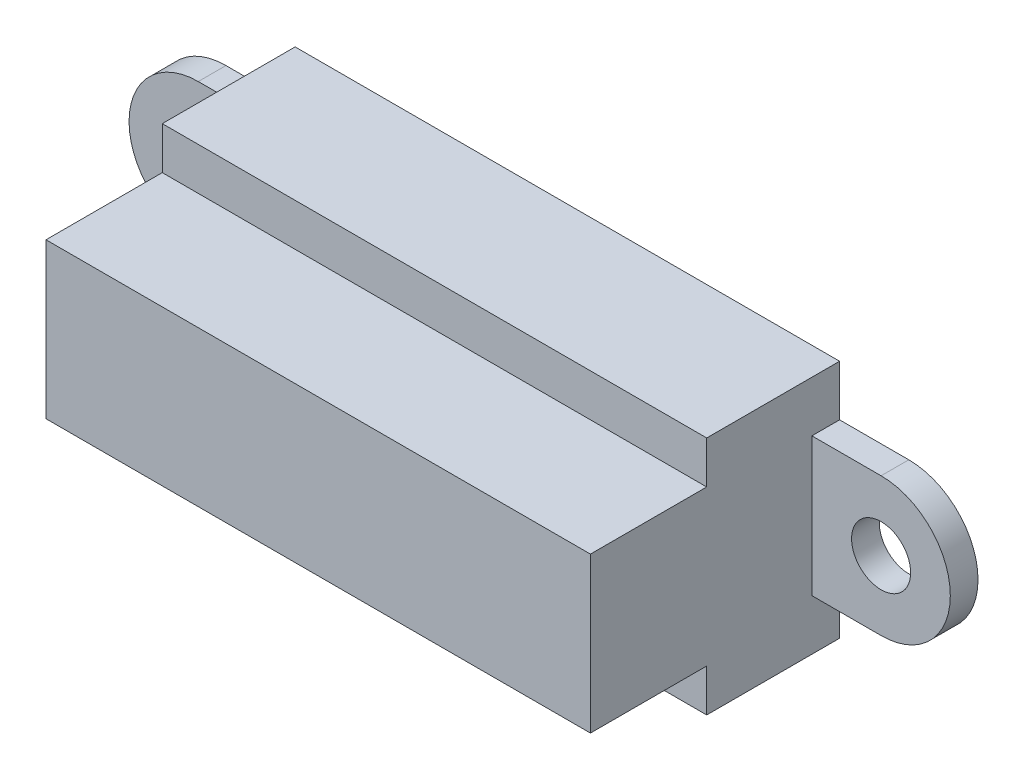
ISO-10303-21;
HEADER;
FILE_DESCRIPTION(('STEP AP214'),'2;1');
FILE_NAME('part.step','',(''),(''),'','','');
FILE_SCHEMA(('AUTOMOTIVE_DESIGN { 1 0 10303 214 1 1 1 1 }'));
ENDSEC;
DATA;
#1=APPLICATION_CONTEXT('core data for automotive mechanical design processes');
#2=APPLICATION_PROTOCOL_DEFINITION('international standard','automotive_design',2000,#1);
#3=PRODUCT_CONTEXT('',#1,'mechanical');
#4=PRODUCT('Part','Part','',(#3));
#5=PRODUCT_RELATED_PRODUCT_CATEGORY('part','',(#4));
#6=PRODUCT_DEFINITION_FORMATION('','',#4);
#7=PRODUCT_DEFINITION_CONTEXT('part definition',#1,'design');
#8=PRODUCT_DEFINITION('design','',#6,#7);
#9=PRODUCT_DEFINITION_SHAPE('','',#8);
#10=(LENGTH_UNIT() NAMED_UNIT(*) SI_UNIT(.MILLI.,.METRE.));
#11=(NAMED_UNIT(*) PLANE_ANGLE_UNIT() SI_UNIT($,.RADIAN.));
#12=(NAMED_UNIT(*) SI_UNIT($,.STERADIAN.) SOLID_ANGLE_UNIT());
#13=UNCERTAINTY_MEASURE_WITH_UNIT(LENGTH_MEASURE(1.E-05),#10,'distance_accuracy_value','');
#14=(GEOMETRIC_REPRESENTATION_CONTEXT(3) GLOBAL_UNCERTAINTY_ASSIGNED_CONTEXT((#13)) GLOBAL_UNIT_ASSIGNED_CONTEXT((#10,
#11,#12)) REPRESENTATION_CONTEXT('',''));
#15=CARTESIAN_POINT('',(0.,0.,0.));
#16=DIRECTION('',(0.,0.,1.));
#17=DIRECTION('',(1.,0.,0.));
#18=AXIS2_PLACEMENT_3D('',#15,#16,#17);
#19=CARTESIAN_POINT('',(0.,0.,7.2));
#20=DIRECTION('',(0.,0.,-1.));
#21=DIRECTION('',(-1.,0.,0.));
#22=AXIS2_PLACEMENT_3D('',#19,#20,#21);
#23=PLANE('',#22);
#24=DIRECTION('',(-1.,0.,0.));
#25=VECTOR('',#24,1.);
#26=CARTESIAN_POINT('',(33.25,4.2,7.2));
#27=LINE('',#26,#25);
#28=CARTESIAN_POINT('',(33.25,4.2,7.2));
#29=VERTEX_POINT('',#28);
#30=CARTESIAN_POINT('',(3.75,4.2,7.2));
#31=VERTEX_POINT('',#30);
#32=EDGE_CURVE('E174',#29,#31,#27,.T.);
#33=ORIENTED_EDGE('',*,*,#32,.F.);
#34=DIRECTION('',(0.,1.,0.));
#35=VECTOR('',#34,1.);
#36=CARTESIAN_POINT('',(33.25,0.,7.2));
#37=LINE('',#36,#35);
#38=CARTESIAN_POINT('',(33.25,6.5,7.2));
#39=VERTEX_POINT('',#38);
#40=EDGE_CURVE('E190',#29,#39,#37,.T.);
#41=ORIENTED_EDGE('',*,*,#40,.T.);
#42=DIRECTION('',(-1.,0.,0.));
#43=VECTOR('',#42,1.);
#44=CARTESIAN_POINT('',(0.,6.5,7.2));
#45=LINE('',#44,#43);
#46=CARTESIAN_POINT('',(3.75,6.5,7.2));
#47=VERTEX_POINT('',#46);
#48=EDGE_CURVE('E194',#39,#47,#45,.T.);
#49=ORIENTED_EDGE('',*,*,#48,.T.);
#50=DIRECTION('',(0.,1.,0.));
#51=VECTOR('',#50,1.);
#52=CARTESIAN_POINT('',(3.75,0.,7.2));
#53=LINE('',#52,#51);
#54=EDGE_CURVE('E56',#31,#47,#53,.T.);
#55=ORIENTED_EDGE('',*,*,#54,.F.);
#56=EDGE_LOOP('',(#33,#41,#49,#55));
#57=FACE_BOUND('',#56,.T.);
#58=ADVANCED_FACE('F41',(#57),#23,.F.);
#59=DIRECTION('',(1.,0.,0.));
#60=VECTOR('',#59,1.);
#61=CARTESIAN_POINT('',(33.25,-4.2,7.2));
#62=LINE('',#61,#60);
#63=CARTESIAN_POINT('',(3.75,-4.2,7.2));
#64=VERTEX_POINT('',#63);
#65=CARTESIAN_POINT('',(33.25,-4.2,7.2));
#66=VERTEX_POINT('',#65);
#67=EDGE_CURVE('E64',#64,#66,#62,.T.);
#68=ORIENTED_EDGE('',*,*,#67,.F.);
#69=CARTESIAN_POINT('',(3.75,-6.5,7.2));
#70=VERTEX_POINT('',#69);
#71=EDGE_CURVE('E178',#70,#64,#53,.T.);
#72=ORIENTED_EDGE('',*,*,#71,.F.);
#73=DIRECTION('',(-1.,0.,0.));
#74=VECTOR('',#73,1.);
#75=CARTESIAN_POINT('',(0.,-6.5,7.2));
#76=LINE('',#75,#74);
#77=CARTESIAN_POINT('',(33.25,-6.5,7.2));
#78=VERTEX_POINT('',#77);
#79=EDGE_CURVE('E189',#78,#70,#76,.T.);
#80=ORIENTED_EDGE('',*,*,#79,.F.);
#81=EDGE_CURVE('E187',#78,#66,#37,.T.);
#82=ORIENTED_EDGE('',*,*,#81,.T.);
#83=EDGE_LOOP('',(#68,#72,#80,#82));
#84=FACE_BOUND('',#83,.T.);
#85=ADVANCED_FACE('F303',(#84),#23,.F.);
#86=CARTESIAN_POINT('',(0.,0.,1.5));
#87=DIRECTION('',(0.,0.,1.));
#88=DIRECTION('',(1.,0.,0.));
#89=AXIS2_PLACEMENT_3D('',#86,#87,#88);
#90=PLANE('',#89);
#91=CARTESIAN_POINT('',(37.,0.,1.5));
#92=DIRECTION('',(0.,0.,1.));
#93=DIRECTION('',(1.,0.,0.));
#94=AXIS2_PLACEMENT_3D('',#91,#92,#93);
#95=CIRCLE('',#94,1.6);
#96=CARTESIAN_POINT('',(38.6,0.,1.5));
#97=VERTEX_POINT('',#96);
#98=EDGE_CURVE('E228',#97,#97,#95,.T.);
#99=ORIENTED_EDGE('',*,*,#98,.F.);
#100=EDGE_LOOP('',(#99));
#101=FACE_BOUND('',#100,.T.);
#102=DIRECTION('',(-1.,0.,0.));
#103=VECTOR('',#102,1.);
#104=CARTESIAN_POINT('',(0.,3.75,1.5));
#105=LINE('',#104,#103);
#106=CARTESIAN_POINT('',(37.,3.75,1.5));
#107=VERTEX_POINT('',#106);
#108=CARTESIAN_POINT('',(33.25,3.75,1.5));
#109=VERTEX_POINT('',#108);
#110=EDGE_CURVE('E251',#107,#109,#105,.T.);
#111=ORIENTED_EDGE('',*,*,#110,.T.);
#112=DIRECTION('',(0.,-1.,0.));
#113=VECTOR('',#112,1.);
#114=CARTESIAN_POINT('',(33.25,0.,1.5));
#115=LINE('',#114,#113);
#116=CARTESIAN_POINT('',(33.25,-3.75,1.5));
#117=VERTEX_POINT('',#116);
#118=EDGE_CURVE('E222',#109,#117,#115,.T.);
#119=ORIENTED_EDGE('',*,*,#118,.T.);
#120=DIRECTION('',(1.,0.,0.));
#121=VECTOR('',#120,1.);
#122=CARTESIAN_POINT('',(0.,-3.75,1.5));
#123=LINE('',#122,#121);
#124=CARTESIAN_POINT('',(37.,-3.75,1.5));
#125=VERTEX_POINT('',#124);
#126=EDGE_CURVE('E243',#117,#125,#123,.T.);
#127=ORIENTED_EDGE('',*,*,#126,.T.);
#128=CARTESIAN_POINT('',(37.,0.,1.5));
#129=DIRECTION('',(0.,0.,1.));
#130=DIRECTION('',(1.,0.,0.));
#131=AXIS2_PLACEMENT_3D('',#128,#129,#130);
#132=CIRCLE('',#131,3.75);
#133=EDGE_CURVE('E248',#125,#107,#132,.T.);
#134=ORIENTED_EDGE('',*,*,#133,.T.);
#135=EDGE_LOOP('',(#111,#119,#127,#134));
#136=FACE_BOUND('',#135,.T.);
#137=ADVANCED_FACE('F336',(#101,#136),#90,.T.);
#138=CARTESIAN_POINT('',(0.,-3.75,1.5));
#139=DIRECTION('',(0.,1.,0.));
#140=DIRECTION('',(0.,0.,1.));
#141=AXIS2_PLACEMENT_3D('',#138,#139,#140);
#142=PLANE('',#141);
#143=DIRECTION('',(0.,0.,1.));
#144=VECTOR('',#143,1.);
#145=CARTESIAN_POINT('',(33.25,-3.75,1.5));
#146=LINE('',#145,#144);
#147=CARTESIAN_POINT('',(33.25,-3.75,0.));
#148=VERTEX_POINT('',#147);
#149=EDGE_CURVE('E224',#148,#117,#146,.T.);
#150=ORIENTED_EDGE('',*,*,#149,.F.);
#151=DIRECTION('',(1.,0.,0.));
#152=VECTOR('',#151,1.);
#153=CARTESIAN_POINT('',(0.,-3.75,0.));
#154=LINE('',#153,#152);
#155=CARTESIAN_POINT('',(37.,-3.75,0.));
#156=VERTEX_POINT('',#155);
#157=EDGE_CURVE('E257',#148,#156,#154,.T.);
#158=ORIENTED_EDGE('',*,*,#157,.T.);
#159=DIRECTION('',(0.,0.,-1.));
#160=VECTOR('',#159,1.);
#161=CARTESIAN_POINT('',(37.,-3.75,1.5));
#162=LINE('',#161,#160);
#163=EDGE_CURVE('E269',#125,#156,#162,.T.);
#164=ORIENTED_EDGE('',*,*,#163,.F.);
#165=ORIENTED_EDGE('',*,*,#126,.F.);
#166=EDGE_LOOP('',(#150,#158,#164,#165));
#167=FACE_BOUND('',#166,.T.);
#168=ADVANCED_FACE('F334',(#167),#142,.F.);
#169=CARTESIAN_POINT('',(0.,3.75,1.5));
#170=DIRECTION('',(0.,-1.,0.));
#171=DIRECTION('',(0.,0.,-1.));
#172=AXIS2_PLACEMENT_3D('',#169,#170,#171);
#173=PLANE('',#172);
#174=DIRECTION('',(0.,0.,-1.));
#175=VECTOR('',#174,1.);
#176=CARTESIAN_POINT('',(33.25,3.75,1.5));
#177=LINE('',#176,#175);
#178=CARTESIAN_POINT('',(33.25,3.75,0.));
#179=VERTEX_POINT('',#178);
#180=EDGE_CURVE('E11',#109,#179,#177,.T.);
#181=ORIENTED_EDGE('',*,*,#180,.F.);
#182=ORIENTED_EDGE('',*,*,#110,.F.);
#183=DIRECTION('',(0.,0.,-1.));
#184=VECTOR('',#183,1.);
#185=CARTESIAN_POINT('',(37.,3.75,1.5));
#186=LINE('',#185,#184);
#187=CARTESIAN_POINT('',(37.,3.75,0.));
#188=VERTEX_POINT('',#187);
#189=EDGE_CURVE('E266',#107,#188,#186,.T.);
#190=ORIENTED_EDGE('',*,*,#189,.T.);
#191=DIRECTION('',(-1.,0.,0.));
#192=VECTOR('',#191,1.);
#193=CARTESIAN_POINT('',(0.,3.75,0.));
#194=LINE('',#193,#192);
#195=EDGE_CURVE('E244',#188,#179,#194,.T.);
#196=ORIENTED_EDGE('',*,*,#195,.T.);
#197=EDGE_LOOP('',(#181,#182,#190,#196));
#198=FACE_BOUND('',#197,.T.);
#199=ADVANCED_FACE('F325',(#198),#173,.F.);
#200=DIRECTION('',(0.,-1.,0.));
#201=VECTOR('',#200,1.);
#202=CARTESIAN_POINT('',(3.75,0.,1.5));
#203=LINE('',#202,#201);
#204=CARTESIAN_POINT('',(3.75,3.75,1.5));
#205=VERTEX_POINT('',#204);
#206=CARTESIAN_POINT('',(3.75,-3.75,1.5));
#207=VERTEX_POINT('',#206);
#208=EDGE_CURVE('E211',#205,#207,#203,.T.);
#209=ORIENTED_EDGE('',*,*,#208,.F.);
#210=CARTESIAN_POINT('',(0.,3.75,1.5));
#211=VERTEX_POINT('',#210);
#212=EDGE_CURVE('E250',#205,#211,#105,.T.);
#213=ORIENTED_EDGE('',*,*,#212,.T.);
#214=CARTESIAN_POINT('',(0.,0.,1.5));
#215=DIRECTION('',(0.,0.,1.));
#216=DIRECTION('',(1.,0.,0.));
#217=AXIS2_PLACEMENT_3D('',#214,#215,#216);
#218=CIRCLE('',#217,3.75);
#219=CARTESIAN_POINT('',(0.,-3.75,1.5));
#220=VERTEX_POINT('',#219);
#221=EDGE_CURVE('E240',#211,#220,#218,.T.);
#222=ORIENTED_EDGE('',*,*,#221,.T.);
#223=EDGE_CURVE('E245',#220,#207,#123,.T.);
#224=ORIENTED_EDGE('',*,*,#223,.T.);
#225=EDGE_LOOP('',(#209,#213,#222,#224));
#226=FACE_BOUND('',#225,.T.);
#227=CARTESIAN_POINT('',(0.,0.,1.5));
#228=DIRECTION('',(0.,0.,1.));
#229=DIRECTION('',(1.,0.,0.));
#230=AXIS2_PLACEMENT_3D('',#227,#228,#229);
#231=CIRCLE('',#230,1.6);
#232=CARTESIAN_POINT('',(1.6,0.,1.5));
#233=VERTEX_POINT('',#232);
#234=EDGE_CURVE('E234',#233,#233,#231,.T.);
#235=ORIENTED_EDGE('',*,*,#234,.F.);
#236=EDGE_LOOP('',(#235));
#237=FACE_BOUND('',#236,.T.);
#238=ADVANCED_FACE('F292',(#226,#237),#90,.T.);
#239=CARTESIAN_POINT('',(0.,0.,0.));
#240=DIRECTION('',(0.,0.,1.));
#241=DIRECTION('',(1.,0.,0.));
#242=AXIS2_PLACEMENT_3D('',#239,#240,#241);
#243=PLANE('',#242);
#244=CARTESIAN_POINT('',(3.75,3.75,0.));
#245=VERTEX_POINT('',#244);
#246=CARTESIAN_POINT('',(0.,3.75,0.));
#247=VERTEX_POINT('',#246);
#248=EDGE_CURVE('E262',#245,#247,#194,.T.);
#249=ORIENTED_EDGE('',*,*,#248,.F.);
#250=DIRECTION('',(0.,1.,0.));
#251=VECTOR('',#250,1.);
#252=CARTESIAN_POINT('',(3.75,0.,0.));
#253=LINE('',#252,#251);
#254=CARTESIAN_POINT('',(3.75,6.5,0.));
#255=VERTEX_POINT('',#254);
#256=EDGE_CURVE('E201',#245,#255,#253,.T.);
#257=ORIENTED_EDGE('',*,*,#256,.T.);
#258=DIRECTION('',(-1.,0.,0.));
#259=VECTOR('',#258,1.);
#260=CARTESIAN_POINT('',(0.,6.5,0.));
#261=LINE('',#260,#259);
#262=CARTESIAN_POINT('',(33.25,6.5,0.));
#263=VERTEX_POINT('',#262);
#264=EDGE_CURVE('E205',#263,#255,#261,.T.);
#265=ORIENTED_EDGE('',*,*,#264,.F.);
#266=DIRECTION('',(0.,1.,0.));
#267=VECTOR('',#266,1.);
#268=CARTESIAN_POINT('',(33.25,0.,0.));
#269=LINE('',#268,#267);
#270=EDGE_CURVE('E179',#179,#263,#269,.T.);
#271=ORIENTED_EDGE('',*,*,#270,.F.);
#272=ORIENTED_EDGE('',*,*,#195,.F.);
#273=CARTESIAN_POINT('',(37.,0.,0.));
#274=DIRECTION('',(0.,0.,1.));
#275=DIRECTION('',(1.,0.,0.));
#276=AXIS2_PLACEMENT_3D('',#273,#274,#275);
#277=CIRCLE('',#276,3.75);
#278=EDGE_CURVE('E260',#156,#188,#277,.T.);
#279=ORIENTED_EDGE('',*,*,#278,.F.);
#280=ORIENTED_EDGE('',*,*,#157,.F.);
#281=CARTESIAN_POINT('',(33.25,-6.5,0.));
#282=VERTEX_POINT('',#281);
#283=EDGE_CURVE('E181',#282,#148,#269,.T.);
#284=ORIENTED_EDGE('',*,*,#283,.F.);
#285=DIRECTION('',(-1.,0.,0.));
#286=VECTOR('',#285,1.);
#287=CARTESIAN_POINT('',(0.,-6.5,0.));
#288=LINE('',#287,#286);
#289=CARTESIAN_POINT('',(3.75,-6.5,0.));
#290=VERTEX_POINT('',#289);
#291=EDGE_CURVE('E198',#282,#290,#288,.T.);
#292=ORIENTED_EDGE('',*,*,#291,.T.);
#293=CARTESIAN_POINT('',(3.75,-3.75,0.));
#294=VERTEX_POINT('',#293);
#295=EDGE_CURVE('E202',#290,#294,#253,.T.);
#296=ORIENTED_EDGE('',*,*,#295,.T.);
#297=CARTESIAN_POINT('',(0.,-3.75,0.));
#298=VERTEX_POINT('',#297);
#299=EDGE_CURVE('E258',#298,#294,#154,.T.);
#300=ORIENTED_EDGE('',*,*,#299,.F.);
#301=CARTESIAN_POINT('',(0.,0.,0.));
#302=DIRECTION('',(0.,0.,1.));
#303=DIRECTION('',(1.,0.,0.));
#304=AXIS2_PLACEMENT_3D('',#301,#302,#303);
#305=CIRCLE('',#304,3.75);
#306=EDGE_CURVE('E237',#247,#298,#305,.T.);
#307=ORIENTED_EDGE('',*,*,#306,.F.);
#308=EDGE_LOOP('',(#249,#257,#265,#271,#272,#279,#280,#284,#292,#296,#300,#307));
#309=FACE_BOUND('',#308,.T.);
#310=CARTESIAN_POINT('',(0.,0.,0.));
#311=DIRECTION('',(0.,0.,1.));
#312=DIRECTION('',(1.,0.,0.));
#313=AXIS2_PLACEMENT_3D('',#310,#311,#312);
#314=CIRCLE('',#313,1.6);
#315=CARTESIAN_POINT('',(1.6,0.,0.));
#316=VERTEX_POINT('',#315);
#317=EDGE_CURVE('E231',#316,#316,#314,.T.);
#318=ORIENTED_EDGE('',*,*,#317,.T.);
#319=EDGE_LOOP('',(#318));
#320=FACE_BOUND('',#319,.T.);
#321=CARTESIAN_POINT('',(37.,0.,0.));
#322=DIRECTION('',(0.,0.,1.));
#323=DIRECTION('',(1.,0.,0.));
#324=AXIS2_PLACEMENT_3D('',#321,#322,#323);
#325=CIRCLE('',#324,1.6);
#326=CARTESIAN_POINT('',(38.6,0.,0.));
#327=VERTEX_POINT('',#326);
#328=EDGE_CURVE('E227',#327,#327,#325,.T.);
#329=ORIENTED_EDGE('',*,*,#328,.T.);
#330=EDGE_LOOP('',(#329));
#331=FACE_BOUND('',#330,.T.);
#332=ADVANCED_FACE('F284',(#309,#320,#331),#243,.F.);
#333=CARTESIAN_POINT('',(0.,0.,1.5));
#334=DIRECTION('',(0.,0.,-1.));
#335=DIRECTION('',(-1.,0.,0.));
#336=AXIS2_PLACEMENT_3D('',#333,#334,#335);
#337=CYLINDRICAL_SURFACE('',#336,3.75);
#338=ORIENTED_EDGE('',*,*,#306,.T.);
#339=DIRECTION('',(0.,0.,-1.));
#340=VECTOR('',#339,1.);
#341=CARTESIAN_POINT('',(0.,-3.75,1.5));
#342=LINE('',#341,#340);
#343=EDGE_CURVE('E272',#220,#298,#342,.T.);
#344=ORIENTED_EDGE('',*,*,#343,.F.);
#345=ORIENTED_EDGE('',*,*,#221,.F.);
#346=DIRECTION('',(0.,0.,-1.));
#347=VECTOR('',#346,1.);
#348=CARTESIAN_POINT('',(0.,3.75,1.5));
#349=LINE('',#348,#347);
#350=EDGE_CURVE('E254',#211,#247,#349,.T.);
#351=ORIENTED_EDGE('',*,*,#350,.T.);
#352=EDGE_LOOP('',(#338,#344,#345,#351));
#353=FACE_BOUND('',#352,.T.);
#354=ADVANCED_FACE('F43',(#353),#337,.T.);
#355=ORIENTED_EDGE('',*,*,#299,.T.);
#356=DIRECTION('',(0.,0.,1.));
#357=VECTOR('',#356,1.);
#358=CARTESIAN_POINT('',(3.75,-3.75,1.5));
#359=LINE('',#358,#357);
#360=EDGE_CURVE('E220',#294,#207,#359,.T.);
#361=ORIENTED_EDGE('',*,*,#360,.T.);
#362=ORIENTED_EDGE('',*,*,#223,.F.);
#363=ORIENTED_EDGE('',*,*,#343,.T.);
#364=EDGE_LOOP('',(#355,#361,#362,#363));
#365=FACE_BOUND('',#364,.T.);
#366=ADVANCED_FACE('F344',(#365),#142,.F.);
#367=CARTESIAN_POINT('',(37.,0.,1.5));
#368=DIRECTION('',(0.,0.,-1.));
#369=DIRECTION('',(-1.,0.,0.));
#370=AXIS2_PLACEMENT_3D('',#367,#368,#369);
#371=CYLINDRICAL_SURFACE('',#370,3.75);
#372=ORIENTED_EDGE('',*,*,#278,.T.);
#373=ORIENTED_EDGE('',*,*,#189,.F.);
#374=ORIENTED_EDGE('',*,*,#133,.F.);
#375=ORIENTED_EDGE('',*,*,#163,.T.);
#376=EDGE_LOOP('',(#372,#373,#374,#375));
#377=FACE_BOUND('',#376,.T.);
#378=ADVANCED_FACE('F330',(#377),#371,.T.);
#379=ORIENTED_EDGE('',*,*,#212,.F.);
#380=DIRECTION('',(0.,0.,-1.));
#381=VECTOR('',#380,1.);
#382=CARTESIAN_POINT('',(3.75,3.75,1.5));
#383=LINE('',#382,#381);
#384=EDGE_CURVE('E49',#205,#245,#383,.T.);
#385=ORIENTED_EDGE('',*,*,#384,.T.);
#386=ORIENTED_EDGE('',*,*,#248,.T.);
#387=ORIENTED_EDGE('',*,*,#350,.F.);
#388=EDGE_LOOP('',(#379,#385,#386,#387));
#389=FACE_BOUND('',#388,.T.);
#390=ADVANCED_FACE('F279',(#389),#173,.F.);
#391=CARTESIAN_POINT('',(0.,0.,1.5));
#392=DIRECTION('',(0.,0.,-1.));
#393=DIRECTION('',(-1.,0.,0.));
#394=AXIS2_PLACEMENT_3D('',#391,#392,#393);
#395=CYLINDRICAL_SURFACE('',#394,1.6);
#396=ORIENTED_EDGE('',*,*,#234,.T.);
#397=EDGE_LOOP('',(#396));
#398=FACE_BOUND('',#397,.T.);
#399=ORIENTED_EDGE('',*,*,#317,.F.);
#400=EDGE_LOOP('',(#399));
#401=FACE_BOUND('',#400,.T.);
#402=ADVANCED_FACE('F366',(#398,#401),#395,.F.);
#403=CARTESIAN_POINT('',(37.,0.,1.5));
#404=DIRECTION('',(0.,0.,-1.));
#405=DIRECTION('',(-1.,0.,0.));
#406=AXIS2_PLACEMENT_3D('',#403,#404,#405);
#407=CYLINDRICAL_SURFACE('',#406,1.6);
#408=ORIENTED_EDGE('',*,*,#98,.T.);
#409=EDGE_LOOP('',(#408));
#410=FACE_BOUND('',#409,.T.);
#411=ORIENTED_EDGE('',*,*,#328,.F.);
#412=EDGE_LOOP('',(#411));
#413=FACE_BOUND('',#412,.T.);
#414=ADVANCED_FACE('F365',(#410,#413),#407,.F.);
#415=CARTESIAN_POINT('',(33.25,0.,7.2));
#416=DIRECTION('',(-1.,0.,0.));
#417=DIRECTION('',(0.,0.,1.));
#418=AXIS2_PLACEMENT_3D('',#415,#416,#417);
#419=PLANE('',#418);
#420=ORIENTED_EDGE('',*,*,#283,.T.);
#421=ORIENTED_EDGE('',*,*,#149,.T.);
#422=ORIENTED_EDGE('',*,*,#118,.F.);
#423=ORIENTED_EDGE('',*,*,#180,.T.);
#424=ORIENTED_EDGE('',*,*,#270,.T.);
#425=DIRECTION('',(0.,0.,-1.));
#426=VECTOR('',#425,1.);
#427=CARTESIAN_POINT('',(33.25,6.5,7.2));
#428=LINE('',#427,#426);
#429=EDGE_CURVE('E208',#39,#263,#428,.T.);
#430=ORIENTED_EDGE('',*,*,#429,.F.);
#431=ORIENTED_EDGE('',*,*,#40,.F.);
#432=DIRECTION('',(0.,0.,-1.));
#433=VECTOR('',#432,1.);
#434=CARTESIAN_POINT('',(33.25,4.2,13.5));
#435=LINE('',#434,#433);
#436=CARTESIAN_POINT('',(33.25,4.2,13.5));
#437=VERTEX_POINT('',#436);
#438=EDGE_CURVE('E183',#437,#29,#435,.T.);
#439=ORIENTED_EDGE('',*,*,#438,.F.);
#440=DIRECTION('',(0.,1.,0.));
#441=VECTOR('',#440,1.);
#442=CARTESIAN_POINT('',(33.25,-4.2,13.5));
#443=LINE('',#442,#441);
#444=CARTESIAN_POINT('',(33.25,-4.2,13.5));
#445=VERTEX_POINT('',#444);
#446=EDGE_CURVE('E164',#445,#437,#443,.T.);
#447=ORIENTED_EDGE('',*,*,#446,.F.);
#448=DIRECTION('',(0.,0.,-1.));
#449=VECTOR('',#448,1.);
#450=CARTESIAN_POINT('',(33.25,-4.2,13.5));
#451=LINE('',#450,#449);
#452=EDGE_CURVE('E161',#445,#66,#451,.T.);
#453=ORIENTED_EDGE('',*,*,#452,.T.);
#454=ORIENTED_EDGE('',*,*,#81,.F.);
#455=DIRECTION('',(0.,0.,-1.));
#456=VECTOR('',#455,1.);
#457=CARTESIAN_POINT('',(33.25,-6.5,7.2));
#458=LINE('',#457,#456);
#459=EDGE_CURVE('E195',#78,#282,#458,.T.);
#460=ORIENTED_EDGE('',*,*,#459,.T.);
#461=EDGE_LOOP('',(#420,#421,#422,#423,#424,#430,#431,#439,#447,#453,#454,#460));
#462=FACE_BOUND('',#461,.T.);
#463=ADVANCED_FACE('F306',(#462),#419,.F.);
#464=CARTESIAN_POINT('',(3.75,0.,7.2));
#465=DIRECTION('',(-1.,0.,0.));
#466=DIRECTION('',(0.,0.,1.));
#467=AXIS2_PLACEMENT_3D('',#464,#465,#466);
#468=PLANE('',#467);
#469=ORIENTED_EDGE('',*,*,#360,.F.);
#470=ORIENTED_EDGE('',*,*,#295,.F.);
#471=DIRECTION('',(0.,0.,-1.));
#472=VECTOR('',#471,1.);
#473=CARTESIAN_POINT('',(3.75,-6.5,7.2));
#474=LINE('',#473,#472);
#475=EDGE_CURVE('E215',#70,#290,#474,.T.);
#476=ORIENTED_EDGE('',*,*,#475,.F.);
#477=ORIENTED_EDGE('',*,*,#71,.T.);
#478=DIRECTION('',(0.,0.,-1.));
#479=VECTOR('',#478,1.);
#480=CARTESIAN_POINT('',(3.75,-4.2,13.5));
#481=LINE('',#480,#479);
#482=CARTESIAN_POINT('',(3.75,-4.2,13.5));
#483=VERTEX_POINT('',#482);
#484=EDGE_CURVE('E159',#483,#64,#481,.T.);
#485=ORIENTED_EDGE('',*,*,#484,.F.);
#486=DIRECTION('',(0.,-1.,0.));
#487=VECTOR('',#486,1.);
#488=CARTESIAN_POINT('',(3.75,-4.2,13.5));
#489=LINE('',#488,#487);
#490=CARTESIAN_POINT('',(3.75,4.2,13.5));
#491=VERTEX_POINT('',#490);
#492=EDGE_CURVE('E165',#491,#483,#489,.T.);
#493=ORIENTED_EDGE('',*,*,#492,.F.);
#494=DIRECTION('',(0.,0.,-1.));
#495=VECTOR('',#494,1.);
#496=CARTESIAN_POINT('',(3.75,4.2,13.5));
#497=LINE('',#496,#495);
#498=EDGE_CURVE('E311',#491,#31,#497,.T.);
#499=ORIENTED_EDGE('',*,*,#498,.T.);
#500=ORIENTED_EDGE('',*,*,#54,.T.);
#501=DIRECTION('',(0.,0.,-1.));
#502=VECTOR('',#501,1.);
#503=CARTESIAN_POINT('',(3.75,6.5,7.2));
#504=LINE('',#503,#502);
#505=EDGE_CURVE('E212',#47,#255,#504,.T.);
#506=ORIENTED_EDGE('',*,*,#505,.T.);
#507=ORIENTED_EDGE('',*,*,#256,.F.);
#508=ORIENTED_EDGE('',*,*,#384,.F.);
#509=ORIENTED_EDGE('',*,*,#208,.T.);
#510=EDGE_LOOP('',(#469,#470,#476,#477,#485,#493,#499,#500,#506,#507,#508,#509));
#511=FACE_BOUND('',#510,.T.);
#512=ADVANCED_FACE('F177',(#511),#468,.T.);
#513=CARTESIAN_POINT('',(0.,6.5,7.2));
#514=DIRECTION('',(0.,-1.,0.));
#515=DIRECTION('',(0.,0.,-1.));
#516=AXIS2_PLACEMENT_3D('',#513,#514,#515);
#517=PLANE('',#516);
#518=ORIENTED_EDGE('',*,*,#264,.T.);
#519=ORIENTED_EDGE('',*,*,#505,.F.);
#520=ORIENTED_EDGE('',*,*,#48,.F.);
#521=ORIENTED_EDGE('',*,*,#429,.T.);
#522=EDGE_LOOP('',(#518,#519,#520,#521));
#523=FACE_BOUND('',#522,.T.);
#524=ADVANCED_FACE('F320',(#523),#517,.F.);
#525=CARTESIAN_POINT('',(0.,-6.5,7.2));
#526=DIRECTION('',(0.,-1.,0.));
#527=DIRECTION('',(0.,0.,-1.));
#528=AXIS2_PLACEMENT_3D('',#525,#526,#527);
#529=PLANE('',#528);
#530=ORIENTED_EDGE('',*,*,#291,.F.);
#531=ORIENTED_EDGE('',*,*,#459,.F.);
#532=ORIENTED_EDGE('',*,*,#79,.T.);
#533=ORIENTED_EDGE('',*,*,#475,.T.);
#534=EDGE_LOOP('',(#530,#531,#532,#533));
#535=FACE_BOUND('',#534,.T.);
#536=ADVANCED_FACE('F300',(#535),#529,.T.);
#537=CARTESIAN_POINT('',(33.25,-4.2,13.5));
#538=DIRECTION('',(0.,1.,0.));
#539=DIRECTION('',(-1.,0.,0.));
#540=AXIS2_PLACEMENT_3D('',#537,#538,#539);
#541=PLANE('',#540);
#542=ORIENTED_EDGE('',*,*,#67,.T.);
#543=ORIENTED_EDGE('',*,*,#452,.F.);
#544=DIRECTION('',(1.,0.,0.));
#545=VECTOR('',#544,1.);
#546=CARTESIAN_POINT('',(33.25,-4.2,13.5));
#547=LINE('',#546,#545);
#548=EDGE_CURVE('E155',#483,#445,#547,.T.);
#549=ORIENTED_EDGE('',*,*,#548,.F.);
#550=ORIENTED_EDGE('',*,*,#484,.T.);
#551=EDGE_LOOP('',(#542,#543,#549,#550));
#552=FACE_BOUND('',#551,.T.);
#553=ADVANCED_FACE('F157',(#552),#541,.F.);
#554=CARTESIAN_POINT('',(33.25,4.2,13.5));
#555=DIRECTION('',(0.,-1.,0.));
#556=DIRECTION('',(1.,0.,0.));
#557=AXIS2_PLACEMENT_3D('',#554,#555,#556);
#558=PLANE('',#557);
#559=ORIENTED_EDGE('',*,*,#32,.T.);
#560=ORIENTED_EDGE('',*,*,#498,.F.);
#561=DIRECTION('',(-1.,0.,0.));
#562=VECTOR('',#561,1.);
#563=CARTESIAN_POINT('',(33.25,4.2,13.5));
#564=LINE('',#563,#562);
#565=EDGE_CURVE('E170',#437,#491,#564,.T.);
#566=ORIENTED_EDGE('',*,*,#565,.F.);
#567=ORIENTED_EDGE('',*,*,#438,.T.);
#568=EDGE_LOOP('',(#559,#560,#566,#567));
#569=FACE_BOUND('',#568,.T.);
#570=ADVANCED_FACE('F316',(#569),#558,.F.);
#571=CARTESIAN_POINT('',(0.,0.,13.5));
#572=DIRECTION('',(0.,0.,1.));
#573=DIRECTION('',(1.,0.,0.));
#574=AXIS2_PLACEMENT_3D('',#571,#572,#573);
#575=PLANE('',#574);
#576=ORIENTED_EDGE('',*,*,#492,.T.);
#577=ORIENTED_EDGE('',*,*,#548,.T.);
#578=ORIENTED_EDGE('',*,*,#446,.T.);
#579=ORIENTED_EDGE('',*,*,#565,.T.);
#580=EDGE_LOOP('',(#576,#577,#578,#579));
#581=FACE_BOUND('',#580,.T.);
#582=ADVANCED_FACE('F168',(#581),#575,.T.);
#583=CLOSED_SHELL('',(#58,#85,#137,#168,#199,#238,#332,#354,#366,#378,#390,#402,#414,#463,#512,
#524,#536,#553,#570,#582));
#584=MANIFOLD_SOLID_BREP('B2',#583);
#585=ADVANCED_BREP_SHAPE_REPRESENTATION('',(#18,#584),#14);
#586=SHAPE_DEFINITION_REPRESENTATION(#9,#585);
ENDSEC;
END-ISO-10303-21;
